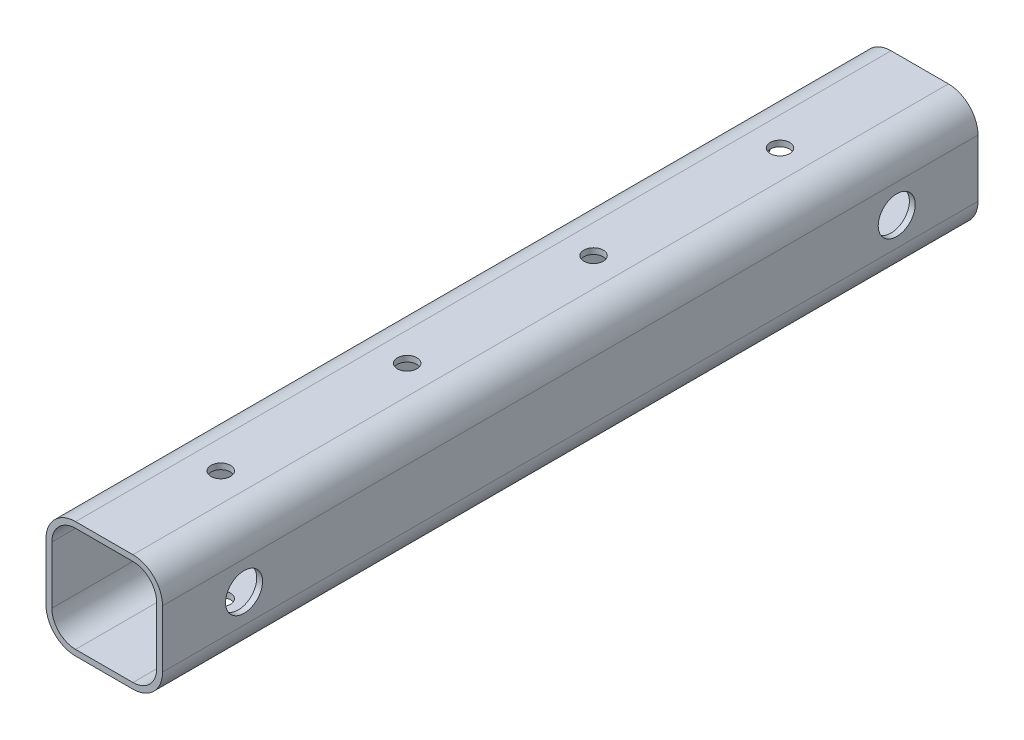
ISO-10303-21;
HEADER;
FILE_DESCRIPTION(('STEP AP214'),'2;1');
FILE_NAME('part.step','',(''),(''),'','','');
FILE_SCHEMA(('AUTOMOTIVE_DESIGN { 1 0 10303 214 1 1 1 1 }'));
ENDSEC;
DATA;
#1=APPLICATION_CONTEXT('core data for automotive mechanical design processes');
#2=APPLICATION_PROTOCOL_DEFINITION('international standard','automotive_design',2000,#1);
#3=PRODUCT_CONTEXT('',#1,'mechanical');
#4=PRODUCT('Part','Part','',(#3));
#5=PRODUCT_RELATED_PRODUCT_CATEGORY('part','',(#4));
#6=PRODUCT_DEFINITION_FORMATION('','',#4);
#7=PRODUCT_DEFINITION_CONTEXT('part definition',#1,'design');
#8=PRODUCT_DEFINITION('design','',#6,#7);
#9=PRODUCT_DEFINITION_SHAPE('','',#8);
#10=(LENGTH_UNIT() NAMED_UNIT(*) SI_UNIT(.MILLI.,.METRE.));
#11=(NAMED_UNIT(*) PLANE_ANGLE_UNIT() SI_UNIT($,.RADIAN.));
#12=(NAMED_UNIT(*) SI_UNIT($,.STERADIAN.) SOLID_ANGLE_UNIT());
#13=UNCERTAINTY_MEASURE_WITH_UNIT(LENGTH_MEASURE(1.E-05),#10,'distance_accuracy_value','');
#14=(GEOMETRIC_REPRESENTATION_CONTEXT(3) GLOBAL_UNCERTAINTY_ASSIGNED_CONTEXT((#13)) GLOBAL_UNIT_ASSIGNED_CONTEXT((#10,
#11,#12)) REPRESENTATION_CONTEXT('',''));
#15=CARTESIAN_POINT('',(0.,0.,0.));
#16=DIRECTION('',(0.,0.,1.));
#17=DIRECTION('',(1.,0.,0.));
#18=AXIS2_PLACEMENT_3D('',#15,#16,#17);
#19=CARTESIAN_POINT('',(12.3,12.3,-350.));
#20=DIRECTION('',(0.,0.,1.));
#21=DIRECTION('',(1.,0.,0.));
#22=AXIS2_PLACEMENT_3D('',#19,#20,#21);
#23=CYLINDRICAL_SURFACE('',#22,12.7);
#24=CARTESIAN_POINT('',(12.3,12.3,0.));
#25=DIRECTION('',(0.,0.,-1.));
#26=DIRECTION('',(-1.,0.,0.));
#27=AXIS2_PLACEMENT_3D('',#24,#25,#26);
#28=CIRCLE('',#27,12.7);
#29=CARTESIAN_POINT('',(12.3,25.,0.));
#30=VERTEX_POINT('',#29);
#31=CARTESIAN_POINT('',(25.,12.3,0.));
#32=VERTEX_POINT('',#31);
#33=EDGE_CURVE('E242',#30,#32,#28,.T.);
#34=ORIENTED_EDGE('',*,*,#33,.T.);
#35=DIRECTION('',(0.,0.,1.));
#36=VECTOR('',#35,1.);
#37=CARTESIAN_POINT('',(25.,12.3,-350.));
#38=LINE('',#37,#36);
#39=CARTESIAN_POINT('',(25.,12.3,-350.));
#40=VERTEX_POINT('',#39);
#41=EDGE_CURVE('E12',#40,#32,#38,.T.);
#42=ORIENTED_EDGE('',*,*,#41,.F.);
#43=CARTESIAN_POINT('',(12.3,12.3,-350.));
#44=DIRECTION('',(0.,0.,-1.));
#45=DIRECTION('',(-1.,0.,0.));
#46=AXIS2_PLACEMENT_3D('',#43,#44,#45);
#47=CIRCLE('',#46,12.7);
#48=CARTESIAN_POINT('',(12.3,25.,-350.));
#49=VERTEX_POINT('',#48);
#50=EDGE_CURVE('E321',#49,#40,#47,.T.);
#51=ORIENTED_EDGE('',*,*,#50,.F.);
#52=DIRECTION('',(0.,0.,1.));
#53=VECTOR('',#52,1.);
#54=CARTESIAN_POINT('',(12.3,25.,-350.));
#55=LINE('',#54,#53);
#56=EDGE_CURVE('E257',#49,#30,#55,.T.);
#57=ORIENTED_EDGE('',*,*,#56,.T.);
#58=EDGE_LOOP('',(#34,#42,#51,#57));
#59=FACE_BOUND('',#58,.T.);
#60=ADVANCED_FACE('F68',(#59),#23,.T.);
#61=CARTESIAN_POINT('',(25.,12.3,-350.));
#62=DIRECTION('',(-1.,0.,0.));
#63=DIRECTION('',(0.,0.,1.));
#64=AXIS2_PLACEMENT_3D('',#61,#62,#63);
#65=PLANE('',#64);
#66=CARTESIAN_POINT('',(25.,2.08166817117217E-13,-315.113369307392));
#67=DIRECTION('',(-1.,0.,0.));
#68=DIRECTION('',(0.,0.,1.));
#69=AXIS2_PLACEMENT_3D('',#66,#67,#68);
#70=CIRCLE('',#69,7.93749999999998);
#71=CARTESIAN_POINT('',(25.,2.08166817117217E-13,-307.175869307392));
#72=VERTEX_POINT('',#71);
#73=EDGE_CURVE('E516',#72,#72,#70,.F.);
#74=ORIENTED_EDGE('',*,*,#73,.F.);
#75=EDGE_LOOP('',(#74));
#76=FACE_BOUND('',#75,.T.);
#77=CARTESIAN_POINT('',(25.,-2.70616862252382E-13,-34.9999999999997));
#78=DIRECTION('',(-1.,0.,0.));
#79=DIRECTION('',(0.,0.,1.));
#80=AXIS2_PLACEMENT_3D('',#77,#78,#79);
#81=CIRCLE('',#80,7.93750000000001);
#82=CARTESIAN_POINT('',(25.,-2.70616862252382E-13,-27.0624999999997));
#83=VERTEX_POINT('',#82);
#84=EDGE_CURVE('E284',#83,#83,#81,.F.);
#85=ORIENTED_EDGE('',*,*,#84,.F.);
#86=EDGE_LOOP('',(#85));
#87=FACE_BOUND('',#86,.T.);
#88=DIRECTION('',(0.,-1.,0.));
#89=VECTOR('',#88,1.);
#90=CARTESIAN_POINT('',(25.,12.3,0.));
#91=LINE('',#90,#89);
#92=CARTESIAN_POINT('',(25.,-12.3,0.));
#93=VERTEX_POINT('',#92);
#94=EDGE_CURVE('E245',#32,#93,#91,.T.);
#95=ORIENTED_EDGE('',*,*,#94,.T.);
#96=DIRECTION('',(0.,0.,1.));
#97=VECTOR('',#96,1.);
#98=CARTESIAN_POINT('',(25.,-12.3,-350.));
#99=LINE('',#98,#97);
#100=CARTESIAN_POINT('',(25.,-12.3,-350.));
#101=VERTEX_POINT('',#100);
#102=EDGE_CURVE('E78',#101,#93,#99,.T.);
#103=ORIENTED_EDGE('',*,*,#102,.F.);
#104=DIRECTION('',(0.,-1.,0.));
#105=VECTOR('',#104,1.);
#106=CARTESIAN_POINT('',(25.,12.3,-350.));
#107=LINE('',#106,#105);
#108=EDGE_CURVE('E323',#40,#101,#107,.T.);
#109=ORIENTED_EDGE('',*,*,#108,.F.);
#110=ORIENTED_EDGE('',*,*,#41,.T.);
#111=EDGE_LOOP('',(#95,#103,#109,#110));
#112=FACE_BOUND('',#111,.T.);
#113=ADVANCED_FACE('F364',(#76,#87,#112),#65,.F.);
#114=CARTESIAN_POINT('',(12.3,-12.3,-350.));
#115=DIRECTION('',(0.,0.,1.));
#116=DIRECTION('',(1.,0.,0.));
#117=AXIS2_PLACEMENT_3D('',#114,#115,#116);
#118=CYLINDRICAL_SURFACE('',#117,12.7);
#119=CARTESIAN_POINT('',(12.3,-12.3,0.));
#120=DIRECTION('',(0.,0.,-1.));
#121=DIRECTION('',(-1.,0.,0.));
#122=AXIS2_PLACEMENT_3D('',#119,#120,#121);
#123=CIRCLE('',#122,12.7);
#124=CARTESIAN_POINT('',(12.3,-25.,0.));
#125=VERTEX_POINT('',#124);
#126=EDGE_CURVE('E247',#93,#125,#123,.T.);
#127=ORIENTED_EDGE('',*,*,#126,.T.);
#128=DIRECTION('',(0.,0.,1.));
#129=VECTOR('',#128,1.);
#130=CARTESIAN_POINT('',(12.3,-25.,-350.));
#131=LINE('',#130,#129);
#132=CARTESIAN_POINT('',(12.3,-25.,-350.));
#133=VERTEX_POINT('',#132);
#134=EDGE_CURVE('E264',#133,#125,#131,.T.);
#135=ORIENTED_EDGE('',*,*,#134,.F.);
#136=CARTESIAN_POINT('',(12.3,-12.3,-350.));
#137=DIRECTION('',(0.,0.,-1.));
#138=DIRECTION('',(-1.,0.,0.));
#139=AXIS2_PLACEMENT_3D('',#136,#137,#138);
#140=CIRCLE('',#139,12.7);
#141=EDGE_CURVE('E325',#101,#133,#140,.T.);
#142=ORIENTED_EDGE('',*,*,#141,.F.);
#143=ORIENTED_EDGE('',*,*,#102,.T.);
#144=EDGE_LOOP('',(#127,#135,#142,#143));
#145=FACE_BOUND('',#144,.T.);
#146=ADVANCED_FACE('F369',(#145),#118,.T.);
#147=CARTESIAN_POINT('',(-12.3,-25.,-350.));
#148=DIRECTION('',(0.,1.,0.));
#149=DIRECTION('',(0.,0.,1.));
#150=AXIS2_PLACEMENT_3D('',#147,#148,#149);
#151=PLANE('',#150);
#152=CARTESIAN_POINT('',(2.22044604925031E-12,-25.,-289.99999999999));
#153=DIRECTION('',(0.,1.,0.));
#154=DIRECTION('',(0.,0.,1.));
#155=AXIS2_PLACEMENT_3D('',#152,#153,#154);
#156=CIRCLE('',#155,4.1671875);
#157=CARTESIAN_POINT('',(2.22044604925031E-12,-25.,-285.83281249999));
#158=VERTEX_POINT('',#157);
#159=EDGE_CURVE('E469',#158,#158,#156,.F.);
#160=ORIENTED_EDGE('',*,*,#159,.F.);
#161=EDGE_LOOP('',(#160));
#162=FACE_BOUND('',#161,.T.);
#163=CARTESIAN_POINT('',(1.77635683940025E-12,-25.,-209.99999999999));
#164=DIRECTION('',(0.,1.,0.));
#165=DIRECTION('',(0.,0.,1.));
#166=AXIS2_PLACEMENT_3D('',#163,#164,#165);
#167=CIRCLE('',#166,4.1671875);
#168=CARTESIAN_POINT('',(1.77635683940025E-12,-25.,-205.83281249999));
#169=VERTEX_POINT('',#168);
#170=EDGE_CURVE('E470',#169,#169,#167,.F.);
#171=ORIENTED_EDGE('',*,*,#170,.F.);
#172=EDGE_LOOP('',(#171));
#173=FACE_BOUND('',#172,.T.);
#174=CARTESIAN_POINT('',(1.33226762955019E-12,-25.,-129.99999999999));
#175=DIRECTION('',(0.,1.,0.));
#176=DIRECTION('',(0.,0.,1.));
#177=AXIS2_PLACEMENT_3D('',#174,#175,#176);
#178=CIRCLE('',#177,4.1671875);
#179=CARTESIAN_POINT('',(1.33226762955019E-12,-25.,-125.83281249999));
#180=VERTEX_POINT('',#179);
#181=EDGE_CURVE('E480',#180,#180,#178,.F.);
#182=ORIENTED_EDGE('',*,*,#181,.F.);
#183=EDGE_LOOP('',(#182));
#184=FACE_BOUND('',#183,.T.);
#185=CARTESIAN_POINT('',(8.88178419700125E-13,-25.,-49.9999999999902));
#186=DIRECTION('',(0.,1.,0.));
#187=DIRECTION('',(0.,0.,1.));
#188=AXIS2_PLACEMENT_3D('',#185,#186,#187);
#189=CIRCLE('',#188,4.1671875);
#190=CARTESIAN_POINT('',(8.88178419700125E-13,-25.,-45.8328124999902));
#191=VERTEX_POINT('',#190);
#192=EDGE_CURVE('E485',#191,#191,#189,.F.);
#193=ORIENTED_EDGE('',*,*,#192,.F.);
#194=EDGE_LOOP('',(#193));
#195=FACE_BOUND('',#194,.T.);
#196=DIRECTION('',(-1.,0.,0.));
#197=VECTOR('',#196,1.);
#198=CARTESIAN_POINT('',(-12.3,-25.,0.));
#199=LINE('',#198,#197);
#200=CARTESIAN_POINT('',(-12.3,-25.,0.));
#201=VERTEX_POINT('',#200);
#202=EDGE_CURVE('E249',#125,#201,#199,.T.);
#203=ORIENTED_EDGE('',*,*,#202,.T.);
#204=DIRECTION('',(0.,0.,1.));
#205=VECTOR('',#204,1.);
#206=CARTESIAN_POINT('',(-12.3,-25.,-350.));
#207=LINE('',#206,#205);
#208=CARTESIAN_POINT('',(-12.3,-25.,-350.));
#209=VERTEX_POINT('',#208);
#210=EDGE_CURVE('E261',#209,#201,#207,.T.);
#211=ORIENTED_EDGE('',*,*,#210,.F.);
#212=DIRECTION('',(-1.,0.,0.));
#213=VECTOR('',#212,1.);
#214=CARTESIAN_POINT('',(-12.3,-25.,-350.));
#215=LINE('',#214,#213);
#216=EDGE_CURVE('E327',#133,#209,#215,.T.);
#217=ORIENTED_EDGE('',*,*,#216,.F.);
#218=ORIENTED_EDGE('',*,*,#134,.T.);
#219=EDGE_LOOP('',(#203,#211,#217,#218));
#220=FACE_BOUND('',#219,.T.);
#221=ADVANCED_FACE('F333',(#162,#173,#184,#195,#220),#151,.F.);
#222=CARTESIAN_POINT('',(-12.3,-12.3,-350.));
#223=DIRECTION('',(0.,0.,1.));
#224=DIRECTION('',(1.,0.,0.));
#225=AXIS2_PLACEMENT_3D('',#222,#223,#224);
#226=CYLINDRICAL_SURFACE('',#225,12.7);
#227=CARTESIAN_POINT('',(-12.3,-12.3,0.));
#228=DIRECTION('',(0.,0.,-1.));
#229=DIRECTION('',(-1.,0.,0.));
#230=AXIS2_PLACEMENT_3D('',#227,#228,#229);
#231=CIRCLE('',#230,12.7);
#232=CARTESIAN_POINT('',(-25.,-12.3,0.));
#233=VERTEX_POINT('',#232);
#234=EDGE_CURVE('E251',#201,#233,#231,.T.);
#235=ORIENTED_EDGE('',*,*,#234,.T.);
#236=DIRECTION('',(0.,0.,1.));
#237=VECTOR('',#236,1.);
#238=CARTESIAN_POINT('',(-25.,-12.3,-350.));
#239=LINE('',#238,#237);
#240=CARTESIAN_POINT('',(-25.,-12.3,-350.));
#241=VERTEX_POINT('',#240);
#242=EDGE_CURVE('E208',#241,#233,#239,.T.);
#243=ORIENTED_EDGE('',*,*,#242,.F.);
#244=CARTESIAN_POINT('',(-12.3,-12.3,-350.));
#245=DIRECTION('',(0.,0.,-1.));
#246=DIRECTION('',(-1.,0.,0.));
#247=AXIS2_PLACEMENT_3D('',#244,#245,#246);
#248=CIRCLE('',#247,12.7);
#249=EDGE_CURVE('E199',#209,#241,#248,.T.);
#250=ORIENTED_EDGE('',*,*,#249,.F.);
#251=ORIENTED_EDGE('',*,*,#210,.T.);
#252=EDGE_LOOP('',(#235,#243,#250,#251));
#253=FACE_BOUND('',#252,.T.);
#254=ADVANCED_FACE('F337',(#253),#226,.T.);
#255=CARTESIAN_POINT('',(-25.,-12.3,-350.));
#256=DIRECTION('',(1.,0.,0.));
#257=DIRECTION('',(0.,0.,-1.));
#258=AXIS2_PLACEMENT_3D('',#255,#256,#257);
#259=PLANE('',#258);
#260=CARTESIAN_POINT('',(-25.,2.08166817117217E-13,-315.113369307392));
#261=DIRECTION('',(-1.,0.,0.));
#262=DIRECTION('',(0.,0.,1.));
#263=AXIS2_PLACEMENT_3D('',#260,#261,#262);
#264=CIRCLE('',#263,7.93749999999998);
#265=CARTESIAN_POINT('',(-25.,2.08166817117217E-13,-307.175869307392));
#266=VERTEX_POINT('',#265);
#267=EDGE_CURVE('E513',#266,#266,#264,.T.);
#268=ORIENTED_EDGE('',*,*,#267,.F.);
#269=EDGE_LOOP('',(#268));
#270=FACE_BOUND('',#269,.T.);
#271=CARTESIAN_POINT('',(-25.,-2.70616862252382E-13,-34.9999999999997));
#272=DIRECTION('',(-1.,0.,0.));
#273=DIRECTION('',(0.,0.,1.));
#274=AXIS2_PLACEMENT_3D('',#271,#272,#273);
#275=CIRCLE('',#274,7.93750000000001);
#276=CARTESIAN_POINT('',(-25.,-2.70616862252382E-13,-27.0624999999997));
#277=VERTEX_POINT('',#276);
#278=EDGE_CURVE('E290',#277,#277,#275,.T.);
#279=ORIENTED_EDGE('',*,*,#278,.F.);
#280=EDGE_LOOP('',(#279));
#281=FACE_BOUND('',#280,.T.);
#282=DIRECTION('',(0.,1.,0.));
#283=VECTOR('',#282,1.);
#284=CARTESIAN_POINT('',(-25.,-12.3,0.));
#285=LINE('',#284,#283);
#286=CARTESIAN_POINT('',(-25.,12.3,0.));
#287=VERTEX_POINT('',#286);
#288=EDGE_CURVE('E207',#233,#287,#285,.T.);
#289=ORIENTED_EDGE('',*,*,#288,.T.);
#290=DIRECTION('',(0.,0.,1.));
#291=VECTOR('',#290,1.);
#292=CARTESIAN_POINT('',(-25.,12.3,-350.));
#293=LINE('',#292,#291);
#294=CARTESIAN_POINT('',(-25.,12.3,-350.));
#295=VERTEX_POINT('',#294);
#296=EDGE_CURVE('E204',#295,#287,#293,.T.);
#297=ORIENTED_EDGE('',*,*,#296,.F.);
#298=DIRECTION('',(0.,1.,0.));
#299=VECTOR('',#298,1.);
#300=CARTESIAN_POINT('',(-25.,-12.3,-350.));
#301=LINE('',#300,#299);
#302=EDGE_CURVE('E193',#241,#295,#301,.T.);
#303=ORIENTED_EDGE('',*,*,#302,.F.);
#304=ORIENTED_EDGE('',*,*,#242,.T.);
#305=EDGE_LOOP('',(#289,#297,#303,#304));
#306=FACE_BOUND('',#305,.T.);
#307=ADVANCED_FACE('F205',(#270,#281,#306),#259,.F.);
#308=CARTESIAN_POINT('',(-12.3,12.3,-350.));
#309=DIRECTION('',(0.,0.,1.));
#310=DIRECTION('',(1.,0.,0.));
#311=AXIS2_PLACEMENT_3D('',#308,#309,#310);
#312=CYLINDRICAL_SURFACE('',#311,12.7);
#313=CARTESIAN_POINT('',(-12.3,12.3,0.));
#314=DIRECTION('',(0.,0.,-1.));
#315=DIRECTION('',(-1.,0.,0.));
#316=AXIS2_PLACEMENT_3D('',#313,#314,#315);
#317=CIRCLE('',#316,12.7);
#318=CARTESIAN_POINT('',(-12.3,25.,0.));
#319=VERTEX_POINT('',#318);
#320=EDGE_CURVE('E140',#287,#319,#317,.T.);
#321=ORIENTED_EDGE('',*,*,#320,.T.);
#322=DIRECTION('',(0.,0.,1.));
#323=VECTOR('',#322,1.);
#324=CARTESIAN_POINT('',(-12.3,25.,-350.));
#325=LINE('',#324,#323);
#326=CARTESIAN_POINT('',(-12.3,25.,-350.));
#327=VERTEX_POINT('',#326);
#328=EDGE_CURVE('E209',#327,#319,#325,.T.);
#329=ORIENTED_EDGE('',*,*,#328,.F.);
#330=CARTESIAN_POINT('',(-12.3,12.3,-350.));
#331=DIRECTION('',(0.,0.,-1.));
#332=DIRECTION('',(-1.,0.,0.));
#333=AXIS2_PLACEMENT_3D('',#330,#331,#332);
#334=CIRCLE('',#333,12.7);
#335=EDGE_CURVE('E197',#295,#327,#334,.T.);
#336=ORIENTED_EDGE('',*,*,#335,.F.);
#337=ORIENTED_EDGE('',*,*,#296,.T.);
#338=EDGE_LOOP('',(#321,#329,#336,#337));
#339=FACE_BOUND('',#338,.T.);
#340=ADVANCED_FACE('F211',(#339),#312,.T.);
#341=CARTESIAN_POINT('',(12.3,-12.3,-350.));
#342=DIRECTION('',(0.,0.,1.));
#343=DIRECTION('',(1.,0.,0.));
#344=AXIS2_PLACEMENT_3D('',#341,#342,#343);
#345=CYLINDRICAL_SURFACE('',#344,10.2);
#346=CARTESIAN_POINT('',(12.3,-12.3,0.));
#347=DIRECTION('',(0.,0.,-1.));
#348=DIRECTION('',(-1.,0.,0.));
#349=AXIS2_PLACEMENT_3D('',#346,#347,#348);
#350=CIRCLE('',#349,10.2);
#351=CARTESIAN_POINT('',(22.5,-12.3,0.));
#352=VERTEX_POINT('',#351);
#353=CARTESIAN_POINT('',(12.3,-22.5,0.));
#354=VERTEX_POINT('',#353);
#355=EDGE_CURVE('E217',#352,#354,#350,.T.);
#356=ORIENTED_EDGE('',*,*,#355,.F.);
#357=DIRECTION('',(0.,0.,1.));
#358=VECTOR('',#357,1.);
#359=CARTESIAN_POINT('',(22.5,-12.3,-350.));
#360=LINE('',#359,#358);
#361=CARTESIAN_POINT('',(22.5,-12.3,-350.));
#362=VERTEX_POINT('',#361);
#363=EDGE_CURVE('E154',#362,#352,#360,.T.);
#364=ORIENTED_EDGE('',*,*,#363,.F.);
#365=CARTESIAN_POINT('',(12.3,-12.3,-350.));
#366=DIRECTION('',(0.,0.,-1.));
#367=DIRECTION('',(-1.,0.,0.));
#368=AXIS2_PLACEMENT_3D('',#365,#366,#367);
#369=CIRCLE('',#368,10.2);
#370=CARTESIAN_POINT('',(12.3,-22.5,-350.));
#371=VERTEX_POINT('',#370);
#372=EDGE_CURVE('E256',#362,#371,#369,.T.);
#373=ORIENTED_EDGE('',*,*,#372,.T.);
#374=DIRECTION('',(0.,0.,1.));
#375=VECTOR('',#374,1.);
#376=CARTESIAN_POINT('',(12.3,-22.5,-350.));
#377=LINE('',#376,#375);
#378=EDGE_CURVE('E213',#371,#354,#377,.T.);
#379=ORIENTED_EDGE('',*,*,#378,.T.);
#380=EDGE_LOOP('',(#356,#364,#373,#379));
#381=FACE_BOUND('',#380,.T.);
#382=ADVANCED_FACE('F70',(#381),#345,.F.);
#383=CARTESIAN_POINT('',(22.5,12.3,-350.));
#384=DIRECTION('',(-1.,0.,0.));
#385=DIRECTION('',(0.,0.,1.));
#386=AXIS2_PLACEMENT_3D('',#383,#384,#385);
#387=PLANE('',#386);
#388=CARTESIAN_POINT('',(22.5,2.08166817117217E-13,-315.113369307392));
#389=DIRECTION('',(-1.,0.,0.));
#390=DIRECTION('',(0.,0.,1.));
#391=AXIS2_PLACEMENT_3D('',#388,#389,#390);
#392=CIRCLE('',#391,7.93749999999998);
#393=CARTESIAN_POINT('',(22.5,2.08166817117217E-13,-307.175869307392));
#394=VERTEX_POINT('',#393);
#395=EDGE_CURVE('E295',#394,#394,#392,.T.);
#396=ORIENTED_EDGE('',*,*,#395,.F.);
#397=EDGE_LOOP('',(#396));
#398=FACE_BOUND('',#397,.T.);
#399=CARTESIAN_POINT('',(22.5,-2.70616862252382E-13,-34.9999999999997));
#400=DIRECTION('',(-1.,0.,0.));
#401=DIRECTION('',(0.,0.,1.));
#402=AXIS2_PLACEMENT_3D('',#399,#400,#401);
#403=CIRCLE('',#402,7.93750000000001);
#404=CARTESIAN_POINT('',(22.5,-2.70616862252382E-13,-27.0624999999997));
#405=VERTEX_POINT('',#404);
#406=EDGE_CURVE('E221',#405,#405,#403,.T.);
#407=ORIENTED_EDGE('',*,*,#406,.F.);
#408=EDGE_LOOP('',(#407));
#409=FACE_BOUND('',#408,.T.);
#410=DIRECTION('',(0.,-1.,0.));
#411=VECTOR('',#410,1.);
#412=CARTESIAN_POINT('',(22.5,12.3,0.));
#413=LINE('',#412,#411);
#414=CARTESIAN_POINT('',(22.5,12.3,0.));
#415=VERTEX_POINT('',#414);
#416=EDGE_CURVE('E220',#415,#352,#413,.T.);
#417=ORIENTED_EDGE('',*,*,#416,.F.);
#418=DIRECTION('',(0.,0.,1.));
#419=VECTOR('',#418,1.);
#420=CARTESIAN_POINT('',(22.5,12.3,-350.));
#421=LINE('',#420,#419);
#422=CARTESIAN_POINT('',(22.5,12.3,-350.));
#423=VERTEX_POINT('',#422);
#424=EDGE_CURVE('E280',#423,#415,#421,.T.);
#425=ORIENTED_EDGE('',*,*,#424,.F.);
#426=DIRECTION('',(0.,-1.,0.));
#427=VECTOR('',#426,1.);
#428=CARTESIAN_POINT('',(22.5,12.3,-350.));
#429=LINE('',#428,#427);
#430=EDGE_CURVE('E300',#423,#362,#429,.T.);
#431=ORIENTED_EDGE('',*,*,#430,.T.);
#432=ORIENTED_EDGE('',*,*,#363,.T.);
#433=EDGE_LOOP('',(#417,#425,#431,#432));
#434=FACE_BOUND('',#433,.T.);
#435=ADVANCED_FACE('F391',(#398,#409,#434),#387,.T.);
#436=CARTESIAN_POINT('',(12.3,12.3,-350.));
#437=DIRECTION('',(0.,0.,1.));
#438=DIRECTION('',(1.,0.,0.));
#439=AXIS2_PLACEMENT_3D('',#436,#437,#438);
#440=CYLINDRICAL_SURFACE('',#439,10.2);
#441=CARTESIAN_POINT('',(12.3,12.3,0.));
#442=DIRECTION('',(0.,0.,-1.));
#443=DIRECTION('',(-1.,0.,0.));
#444=AXIS2_PLACEMENT_3D('',#441,#442,#443);
#445=CIRCLE('',#444,10.2);
#446=CARTESIAN_POINT('',(12.3,22.5,0.));
#447=VERTEX_POINT('',#446);
#448=EDGE_CURVE('E224',#447,#415,#445,.T.);
#449=ORIENTED_EDGE('',*,*,#448,.F.);
#450=DIRECTION('',(0.,0.,1.));
#451=VECTOR('',#450,1.);
#452=CARTESIAN_POINT('',(12.3,22.5,-350.));
#453=LINE('',#452,#451);
#454=CARTESIAN_POINT('',(12.3,22.5,-350.));
#455=VERTEX_POINT('',#454);
#456=EDGE_CURVE('E278',#455,#447,#453,.T.);
#457=ORIENTED_EDGE('',*,*,#456,.F.);
#458=CARTESIAN_POINT('',(12.3,12.3,-350.));
#459=DIRECTION('',(0.,0.,-1.));
#460=DIRECTION('',(-1.,0.,0.));
#461=AXIS2_PLACEMENT_3D('',#458,#459,#460);
#462=CIRCLE('',#461,10.2);
#463=EDGE_CURVE('E303',#455,#423,#462,.T.);
#464=ORIENTED_EDGE('',*,*,#463,.T.);
#465=ORIENTED_EDGE('',*,*,#424,.T.);
#466=EDGE_LOOP('',(#449,#457,#464,#465));
#467=FACE_BOUND('',#466,.T.);
#468=ADVANCED_FACE('F388',(#467),#440,.F.);
#469=CARTESIAN_POINT('',(12.3,22.5,-350.));
#470=DIRECTION('',(0.,-1.,0.));
#471=DIRECTION('',(0.,0.,-1.));
#472=AXIS2_PLACEMENT_3D('',#469,#470,#471);
#473=PLANE('',#472);
#474=CARTESIAN_POINT('',(2.22044604925031E-12,22.5,-289.99999999999));
#475=DIRECTION('',(0.,-1.,0.));
#476=DIRECTION('',(0.,0.,-1.));
#477=AXIS2_PLACEMENT_3D('',#474,#475,#476);
#478=CIRCLE('',#477,4.1671875);
#479=CARTESIAN_POINT('',(2.22044604925031E-12,22.5,-294.16718749999));
#480=VERTEX_POINT('',#479);
#481=EDGE_CURVE('E466',#480,#480,#478,.T.);
#482=ORIENTED_EDGE('',*,*,#481,.F.);
#483=EDGE_LOOP('',(#482));
#484=FACE_BOUND('',#483,.T.);
#485=CARTESIAN_POINT('',(1.77635683940025E-12,22.5,-209.99999999999));
#486=DIRECTION('',(0.,-1.,0.));
#487=DIRECTION('',(0.,0.,-1.));
#488=AXIS2_PLACEMENT_3D('',#485,#486,#487);
#489=CIRCLE('',#488,4.1671875);
#490=CARTESIAN_POINT('',(1.77635683940025E-12,22.5,-214.16718749999));
#491=VERTEX_POINT('',#490);
#492=EDGE_CURVE('E507',#491,#491,#489,.T.);
#493=ORIENTED_EDGE('',*,*,#492,.F.);
#494=EDGE_LOOP('',(#493));
#495=FACE_BOUND('',#494,.T.);
#496=CARTESIAN_POINT('',(1.33226762955019E-12,22.5,-129.99999999999));
#497=DIRECTION('',(0.,-1.,0.));
#498=DIRECTION('',(0.,0.,-1.));
#499=AXIS2_PLACEMENT_3D('',#496,#497,#498);
#500=CIRCLE('',#499,4.1671875);
#501=CARTESIAN_POINT('',(1.33226762955019E-12,22.5,-134.16718749999));
#502=VERTEX_POINT('',#501);
#503=EDGE_CURVE('E501',#502,#502,#500,.T.);
#504=ORIENTED_EDGE('',*,*,#503,.F.);
#505=EDGE_LOOP('',(#504));
#506=FACE_BOUND('',#505,.T.);
#507=CARTESIAN_POINT('',(8.88178419700125E-13,22.5,-49.9999999999902));
#508=DIRECTION('',(0.,-1.,0.));
#509=DIRECTION('',(0.,0.,-1.));
#510=AXIS2_PLACEMENT_3D('',#507,#508,#509);
#511=CIRCLE('',#510,4.1671875);
#512=CARTESIAN_POINT('',(8.88178419700125E-13,22.5,-54.1671874999902));
#513=VERTEX_POINT('',#512);
#514=EDGE_CURVE('E495',#513,#513,#511,.T.);
#515=ORIENTED_EDGE('',*,*,#514,.F.);
#516=EDGE_LOOP('',(#515));
#517=FACE_BOUND('',#516,.T.);
#518=DIRECTION('',(1.,0.,0.));
#519=VECTOR('',#518,1.);
#520=CARTESIAN_POINT('',(12.3,22.5,0.));
#521=LINE('',#520,#519);
#522=CARTESIAN_POINT('',(-12.3,22.5,0.));
#523=VERTEX_POINT('',#522);
#524=EDGE_CURVE('E227',#523,#447,#521,.T.);
#525=ORIENTED_EDGE('',*,*,#524,.F.);
#526=DIRECTION('',(0.,0.,1.));
#527=VECTOR('',#526,1.);
#528=CARTESIAN_POINT('',(-12.3,22.5,-350.));
#529=LINE('',#528,#527);
#530=CARTESIAN_POINT('',(-12.3,22.5,-350.));
#531=VERTEX_POINT('',#530);
#532=EDGE_CURVE('E276',#531,#523,#529,.T.);
#533=ORIENTED_EDGE('',*,*,#532,.F.);
#534=DIRECTION('',(1.,0.,0.));
#535=VECTOR('',#534,1.);
#536=CARTESIAN_POINT('',(12.3,22.5,-350.));
#537=LINE('',#536,#535);
#538=EDGE_CURVE('E306',#531,#455,#537,.T.);
#539=ORIENTED_EDGE('',*,*,#538,.T.);
#540=ORIENTED_EDGE('',*,*,#456,.T.);
#541=EDGE_LOOP('',(#525,#533,#539,#540));
#542=FACE_BOUND('',#541,.T.);
#543=ADVANCED_FACE('F384',(#484,#495,#506,#517,#542),#473,.T.);
#544=CARTESIAN_POINT('',(-12.3,12.3,-350.));
#545=DIRECTION('',(0.,0.,1.));
#546=DIRECTION('',(1.,0.,0.));
#547=AXIS2_PLACEMENT_3D('',#544,#545,#546);
#548=CYLINDRICAL_SURFACE('',#547,10.2);
#549=CARTESIAN_POINT('',(-12.3,12.3,0.));
#550=DIRECTION('',(0.,0.,-1.));
#551=DIRECTION('',(-1.,0.,0.));
#552=AXIS2_PLACEMENT_3D('',#549,#550,#551);
#553=CIRCLE('',#552,10.2);
#554=CARTESIAN_POINT('',(-22.5,12.3,0.));
#555=VERTEX_POINT('',#554);
#556=EDGE_CURVE('E230',#555,#523,#553,.T.);
#557=ORIENTED_EDGE('',*,*,#556,.F.);
#558=DIRECTION('',(0.,0.,1.));
#559=VECTOR('',#558,1.);
#560=CARTESIAN_POINT('',(-22.5,12.3,-350.));
#561=LINE('',#560,#559);
#562=CARTESIAN_POINT('',(-22.5,12.3,-350.));
#563=VERTEX_POINT('',#562);
#564=EDGE_CURVE('E274',#563,#555,#561,.T.);
#565=ORIENTED_EDGE('',*,*,#564,.F.);
#566=CARTESIAN_POINT('',(-12.3,12.3,-350.));
#567=DIRECTION('',(0.,0.,-1.));
#568=DIRECTION('',(-1.,0.,0.));
#569=AXIS2_PLACEMENT_3D('',#566,#567,#568);
#570=CIRCLE('',#569,10.2);
#571=EDGE_CURVE('E309',#563,#531,#570,.T.);
#572=ORIENTED_EDGE('',*,*,#571,.T.);
#573=ORIENTED_EDGE('',*,*,#532,.T.);
#574=EDGE_LOOP('',(#557,#565,#572,#573));
#575=FACE_BOUND('',#574,.T.);
#576=ADVANCED_FACE('F380',(#575),#548,.F.);
#577=CARTESIAN_POINT('',(-22.5,-12.3,-350.));
#578=DIRECTION('',(1.,0.,0.));
#579=DIRECTION('',(0.,0.,-1.));
#580=AXIS2_PLACEMENT_3D('',#577,#578,#579);
#581=PLANE('',#580);
#582=CARTESIAN_POINT('',(-22.5,2.08166817117217E-13,-315.113369307392));
#583=DIRECTION('',(1.,0.,0.));
#584=DIRECTION('',(0.,0.,-1.));
#585=AXIS2_PLACEMENT_3D('',#582,#583,#584);
#586=CIRCLE('',#585,7.93749999999998);
#587=CARTESIAN_POINT('',(-22.5,2.08166817117217E-13,-323.050869307392));
#588=VERTEX_POINT('',#587);
#589=EDGE_CURVE('E72',#588,#588,#586,.T.);
#590=ORIENTED_EDGE('',*,*,#589,.F.);
#591=EDGE_LOOP('',(#590));
#592=FACE_BOUND('',#591,.T.);
#593=CARTESIAN_POINT('',(-22.5,-2.70616862252382E-13,-34.9999999999997));
#594=DIRECTION('',(1.,0.,0.));
#595=DIRECTION('',(0.,0.,-1.));
#596=AXIS2_PLACEMENT_3D('',#593,#594,#595);
#597=CIRCLE('',#596,7.93750000000001);
#598=CARTESIAN_POINT('',(-22.5,-2.70616862252382E-13,-42.9374999999997));
#599=VERTEX_POINT('',#598);
#600=EDGE_CURVE('E282',#599,#599,#597,.T.);
#601=ORIENTED_EDGE('',*,*,#600,.F.);
#602=EDGE_LOOP('',(#601));
#603=FACE_BOUND('',#602,.T.);
#604=DIRECTION('',(0.,1.,0.));
#605=VECTOR('',#604,1.);
#606=CARTESIAN_POINT('',(-22.5,-12.3,0.));
#607=LINE('',#606,#605);
#608=CARTESIAN_POINT('',(-22.5,-12.3,0.));
#609=VERTEX_POINT('',#608);
#610=EDGE_CURVE('E233',#609,#555,#607,.T.);
#611=ORIENTED_EDGE('',*,*,#610,.F.);
#612=DIRECTION('',(0.,0.,1.));
#613=VECTOR('',#612,1.);
#614=CARTESIAN_POINT('',(-22.5,-12.3,-350.));
#615=LINE('',#614,#613);
#616=CARTESIAN_POINT('',(-22.5,-12.3,-350.));
#617=VERTEX_POINT('',#616);
#618=EDGE_CURVE('E272',#617,#609,#615,.T.);
#619=ORIENTED_EDGE('',*,*,#618,.F.);
#620=DIRECTION('',(0.,1.,0.));
#621=VECTOR('',#620,1.);
#622=CARTESIAN_POINT('',(-22.5,-12.3,-350.));
#623=LINE('',#622,#621);
#624=EDGE_CURVE('E312',#617,#563,#623,.T.);
#625=ORIENTED_EDGE('',*,*,#624,.T.);
#626=ORIENTED_EDGE('',*,*,#564,.T.);
#627=EDGE_LOOP('',(#611,#619,#625,#626));
#628=FACE_BOUND('',#627,.T.);
#629=ADVANCED_FACE('F376',(#592,#603,#628),#581,.T.);
#630=CARTESIAN_POINT('',(-12.3,-12.3,-350.));
#631=DIRECTION('',(0.,0.,1.));
#632=DIRECTION('',(1.,0.,0.));
#633=AXIS2_PLACEMENT_3D('',#630,#631,#632);
#634=CYLINDRICAL_SURFACE('',#633,10.2);
#635=CARTESIAN_POINT('',(-12.3,-12.3,0.));
#636=DIRECTION('',(0.,0.,-1.));
#637=DIRECTION('',(-1.,0.,0.));
#638=AXIS2_PLACEMENT_3D('',#635,#636,#637);
#639=CIRCLE('',#638,10.2);
#640=CARTESIAN_POINT('',(-12.3,-22.5,0.));
#641=VERTEX_POINT('',#640);
#642=EDGE_CURVE('E236',#641,#609,#639,.T.);
#643=ORIENTED_EDGE('',*,*,#642,.F.);
#644=DIRECTION('',(0.,0.,1.));
#645=VECTOR('',#644,1.);
#646=CARTESIAN_POINT('',(-12.3,-22.5,-350.));
#647=LINE('',#646,#645);
#648=CARTESIAN_POINT('',(-12.3,-22.5,-350.));
#649=VERTEX_POINT('',#648);
#650=EDGE_CURVE('E270',#649,#641,#647,.T.);
#651=ORIENTED_EDGE('',*,*,#650,.F.);
#652=CARTESIAN_POINT('',(-12.3,-12.3,-350.));
#653=DIRECTION('',(0.,0.,-1.));
#654=DIRECTION('',(-1.,0.,0.));
#655=AXIS2_PLACEMENT_3D('',#652,#653,#654);
#656=CIRCLE('',#655,10.2);
#657=EDGE_CURVE('E315',#649,#617,#656,.T.);
#658=ORIENTED_EDGE('',*,*,#657,.T.);
#659=ORIENTED_EDGE('',*,*,#618,.T.);
#660=EDGE_LOOP('',(#643,#651,#658,#659));
#661=FACE_BOUND('',#660,.T.);
#662=ADVANCED_FACE('F356',(#661),#634,.F.);
#663=CARTESIAN_POINT('',(-12.3,-22.5,-350.));
#664=DIRECTION('',(0.,1.,0.));
#665=DIRECTION('',(0.,0.,1.));
#666=AXIS2_PLACEMENT_3D('',#663,#664,#665);
#667=PLANE('',#666);
#668=CARTESIAN_POINT('',(2.22044604925031E-12,-22.5,-289.99999999999));
#669=DIRECTION('',(0.,1.,0.));
#670=DIRECTION('',(0.,0.,1.));
#671=AXIS2_PLACEMENT_3D('',#668,#669,#670);
#672=CIRCLE('',#671,4.1671875);
#673=CARTESIAN_POINT('',(2.22044604925031E-12,-22.5,-285.83281249999));
#674=VERTEX_POINT('',#673);
#675=EDGE_CURVE('E510',#674,#674,#672,.T.);
#676=ORIENTED_EDGE('',*,*,#675,.F.);
#677=EDGE_LOOP('',(#676));
#678=FACE_BOUND('',#677,.T.);
#679=CARTESIAN_POINT('',(1.77635683940025E-12,-22.5,-209.99999999999));
#680=DIRECTION('',(0.,1.,0.));
#681=DIRECTION('',(0.,0.,1.));
#682=AXIS2_PLACEMENT_3D('',#679,#680,#681);
#683=CIRCLE('',#682,4.1671875);
#684=CARTESIAN_POINT('',(1.77635683940025E-12,-22.5,-205.83281249999));
#685=VERTEX_POINT('',#684);
#686=EDGE_CURVE('E504',#685,#685,#683,.T.);
#687=ORIENTED_EDGE('',*,*,#686,.F.);
#688=EDGE_LOOP('',(#687));
#689=FACE_BOUND('',#688,.T.);
#690=CARTESIAN_POINT('',(1.33226762955019E-12,-22.5,-129.99999999999));
#691=DIRECTION('',(0.,1.,0.));
#692=DIRECTION('',(0.,0.,1.));
#693=AXIS2_PLACEMENT_3D('',#690,#691,#692);
#694=CIRCLE('',#693,4.1671875);
#695=CARTESIAN_POINT('',(1.33226762955019E-12,-22.5,-125.83281249999));
#696=VERTEX_POINT('',#695);
#697=EDGE_CURVE('E498',#696,#696,#694,.T.);
#698=ORIENTED_EDGE('',*,*,#697,.F.);
#699=EDGE_LOOP('',(#698));
#700=FACE_BOUND('',#699,.T.);
#701=CARTESIAN_POINT('',(8.88178419700125E-13,-22.5,-49.9999999999902));
#702=DIRECTION('',(0.,1.,0.));
#703=DIRECTION('',(0.,0.,1.));
#704=AXIS2_PLACEMENT_3D('',#701,#702,#703);
#705=CIRCLE('',#704,4.1671875);
#706=CARTESIAN_POINT('',(8.88178419700125E-13,-22.5,-45.8328124999902));
#707=VERTEX_POINT('',#706);
#708=EDGE_CURVE('E473',#707,#707,#705,.T.);
#709=ORIENTED_EDGE('',*,*,#708,.F.);
#710=EDGE_LOOP('',(#709));
#711=FACE_BOUND('',#710,.T.);
#712=DIRECTION('',(-1.,0.,0.));
#713=VECTOR('',#712,1.);
#714=CARTESIAN_POINT('',(-12.3,-22.5,0.));
#715=LINE('',#714,#713);
#716=EDGE_CURVE('E239',#354,#641,#715,.T.);
#717=ORIENTED_EDGE('',*,*,#716,.F.);
#718=ORIENTED_EDGE('',*,*,#378,.F.);
#719=DIRECTION('',(-1.,0.,0.));
#720=VECTOR('',#719,1.);
#721=CARTESIAN_POINT('',(-12.3,-22.5,-350.));
#722=LINE('',#721,#720);
#723=EDGE_CURVE('E318',#371,#649,#722,.T.);
#724=ORIENTED_EDGE('',*,*,#723,.T.);
#725=ORIENTED_EDGE('',*,*,#650,.T.);
#726=EDGE_LOOP('',(#717,#718,#724,#725));
#727=FACE_BOUND('',#726,.T.);
#728=ADVANCED_FACE('F347',(#678,#689,#700,#711,#727),#667,.T.);
#729=CARTESIAN_POINT('',(12.3,25.,-350.));
#730=DIRECTION('',(0.,-1.,0.));
#731=DIRECTION('',(0.,0.,-1.));
#732=AXIS2_PLACEMENT_3D('',#729,#730,#731);
#733=PLANE('',#732);
#734=CARTESIAN_POINT('',(2.22044604925031E-12,25.,-289.99999999999));
#735=DIRECTION('',(0.,1.,0.));
#736=DIRECTION('',(0.,0.,1.));
#737=AXIS2_PLACEMENT_3D('',#734,#735,#736);
#738=CIRCLE('',#737,4.1671875);
#739=CARTESIAN_POINT('',(2.22044604925031E-12,25.,-285.83281249999));
#740=VERTEX_POINT('',#739);
#741=EDGE_CURVE('E468',#740,#740,#738,.T.);
#742=ORIENTED_EDGE('',*,*,#741,.F.);
#743=EDGE_LOOP('',(#742));
#744=FACE_BOUND('',#743,.T.);
#745=CARTESIAN_POINT('',(1.77635683940025E-12,25.,-209.99999999999));
#746=DIRECTION('',(0.,1.,0.));
#747=DIRECTION('',(0.,0.,1.));
#748=AXIS2_PLACEMENT_3D('',#745,#746,#747);
#749=CIRCLE('',#748,4.1671875);
#750=CARTESIAN_POINT('',(1.77635683940025E-12,25.,-205.83281249999));
#751=VERTEX_POINT('',#750);
#752=EDGE_CURVE('E476',#751,#751,#749,.T.);
#753=ORIENTED_EDGE('',*,*,#752,.F.);
#754=EDGE_LOOP('',(#753));
#755=FACE_BOUND('',#754,.T.);
#756=CARTESIAN_POINT('',(1.33226762955019E-12,25.,-129.99999999999));
#757=DIRECTION('',(0.,1.,0.));
#758=DIRECTION('',(0.,0.,1.));
#759=AXIS2_PLACEMENT_3D('',#756,#757,#758);
#760=CIRCLE('',#759,4.1671875);
#761=CARTESIAN_POINT('',(1.33226762955019E-12,25.,-125.83281249999));
#762=VERTEX_POINT('',#761);
#763=EDGE_CURVE('E482',#762,#762,#760,.T.);
#764=ORIENTED_EDGE('',*,*,#763,.F.);
#765=EDGE_LOOP('',(#764));
#766=FACE_BOUND('',#765,.T.);
#767=CARTESIAN_POINT('',(8.88178419700125E-13,25.,-49.9999999999902));
#768=DIRECTION('',(0.,1.,0.));
#769=DIRECTION('',(0.,0.,1.));
#770=AXIS2_PLACEMENT_3D('',#767,#768,#769);
#771=CIRCLE('',#770,4.1671875);
#772=CARTESIAN_POINT('',(8.88178419700125E-13,25.,-45.8328124999902));
#773=VERTEX_POINT('',#772);
#774=EDGE_CURVE('E488',#773,#773,#771,.T.);
#775=ORIENTED_EDGE('',*,*,#774,.F.);
#776=EDGE_LOOP('',(#775));
#777=FACE_BOUND('',#776,.T.);
#778=DIRECTION('',(1.,0.,0.));
#779=VECTOR('',#778,1.);
#780=CARTESIAN_POINT('',(12.3,25.,0.));
#781=LINE('',#780,#779);
#782=EDGE_CURVE('E146',#319,#30,#781,.T.);
#783=ORIENTED_EDGE('',*,*,#782,.T.);
#784=ORIENTED_EDGE('',*,*,#56,.F.);
#785=DIRECTION('',(1.,0.,0.));
#786=VECTOR('',#785,1.);
#787=CARTESIAN_POINT('',(12.3,25.,-350.));
#788=LINE('',#787,#786);
#789=EDGE_CURVE('E87',#327,#49,#788,.T.);
#790=ORIENTED_EDGE('',*,*,#789,.F.);
#791=ORIENTED_EDGE('',*,*,#328,.T.);
#792=EDGE_LOOP('',(#783,#784,#790,#791));
#793=FACE_BOUND('',#792,.T.);
#794=ADVANCED_FACE('F345',(#744,#755,#766,#777,#793),#733,.F.);
#795=CARTESIAN_POINT('',(12.3,12.3,-350.));
#796=DIRECTION('',(0.,0.,-1.));
#797=DIRECTION('',(-1.,0.,0.));
#798=AXIS2_PLACEMENT_3D('',#795,#796,#797);
#799=PLANE('',#798);
#800=ORIENTED_EDGE('',*,*,#372,.F.);
#801=ORIENTED_EDGE('',*,*,#430,.F.);
#802=ORIENTED_EDGE('',*,*,#463,.F.);
#803=ORIENTED_EDGE('',*,*,#538,.F.);
#804=ORIENTED_EDGE('',*,*,#571,.F.);
#805=ORIENTED_EDGE('',*,*,#624,.F.);
#806=ORIENTED_EDGE('',*,*,#657,.F.);
#807=ORIENTED_EDGE('',*,*,#723,.F.);
#808=EDGE_LOOP('',(#800,#801,#802,#803,#804,#805,#806,#807));
#809=FACE_BOUND('',#808,.T.);
#810=ORIENTED_EDGE('',*,*,#50,.T.);
#811=ORIENTED_EDGE('',*,*,#108,.T.);
#812=ORIENTED_EDGE('',*,*,#141,.T.);
#813=ORIENTED_EDGE('',*,*,#216,.T.);
#814=ORIENTED_EDGE('',*,*,#249,.T.);
#815=ORIENTED_EDGE('',*,*,#302,.T.);
#816=ORIENTED_EDGE('',*,*,#335,.T.);
#817=ORIENTED_EDGE('',*,*,#789,.T.);
#818=EDGE_LOOP('',(#810,#811,#812,#813,#814,#815,#816,#817));
#819=FACE_BOUND('',#818,.T.);
#820=ADVANCED_FACE('F195',(#809,#819),#799,.T.);
#821=CARTESIAN_POINT('',(12.3,12.3,0.));
#822=DIRECTION('',(0.,0.,-1.));
#823=DIRECTION('',(-1.,0.,0.));
#824=AXIS2_PLACEMENT_3D('',#821,#822,#823);
#825=PLANE('',#824);
#826=ORIENTED_EDGE('',*,*,#355,.T.);
#827=ORIENTED_EDGE('',*,*,#716,.T.);
#828=ORIENTED_EDGE('',*,*,#642,.T.);
#829=ORIENTED_EDGE('',*,*,#610,.T.);
#830=ORIENTED_EDGE('',*,*,#556,.T.);
#831=ORIENTED_EDGE('',*,*,#524,.T.);
#832=ORIENTED_EDGE('',*,*,#448,.T.);
#833=ORIENTED_EDGE('',*,*,#416,.T.);
#834=EDGE_LOOP('',(#826,#827,#828,#829,#830,#831,#832,#833));
#835=FACE_BOUND('',#834,.T.);
#836=ORIENTED_EDGE('',*,*,#33,.F.);
#837=ORIENTED_EDGE('',*,*,#782,.F.);
#838=ORIENTED_EDGE('',*,*,#320,.F.);
#839=ORIENTED_EDGE('',*,*,#288,.F.);
#840=ORIENTED_EDGE('',*,*,#234,.F.);
#841=ORIENTED_EDGE('',*,*,#202,.F.);
#842=ORIENTED_EDGE('',*,*,#126,.F.);
#843=ORIENTED_EDGE('',*,*,#94,.F.);
#844=EDGE_LOOP('',(#836,#837,#838,#839,#840,#841,#842,#843));
#845=FACE_BOUND('',#844,.T.);
#846=ADVANCED_FACE('F340',(#835,#845),#825,.F.);
#847=CARTESIAN_POINT('',(47.4506403026729,-2.70616862252382E-13,-34.9999999999997));
#848=DIRECTION('',(-1.,0.,0.));
#849=DIRECTION('',(0.,0.,1.));
#850=AXIS2_PLACEMENT_3D('',#847,#848,#849);
#851=CYLINDRICAL_SURFACE('',#850,7.93750000000001);
#852=ORIENTED_EDGE('',*,*,#600,.T.);
#853=EDGE_LOOP('',(#852));
#854=FACE_BOUND('',#853,.T.);
#855=ORIENTED_EDGE('',*,*,#278,.T.);
#856=EDGE_LOOP('',(#855));
#857=FACE_BOUND('',#856,.T.);
#858=ADVANCED_FACE('F422',(#854,#857),#851,.F.);
#859=ORIENTED_EDGE('',*,*,#406,.T.);
#860=EDGE_LOOP('',(#859));
#861=FACE_BOUND('',#860,.T.);
#862=ORIENTED_EDGE('',*,*,#84,.T.);
#863=EDGE_LOOP('',(#862));
#864=FACE_BOUND('',#863,.T.);
#865=ADVANCED_FACE('F426',(#861,#864),#851,.F.);
#866=CARTESIAN_POINT('',(47.4506403026728,2.08166817117217E-13,-315.113369307392));
#867=DIRECTION('',(-1.,0.,0.));
#868=DIRECTION('',(0.,0.,1.));
#869=AXIS2_PLACEMENT_3D('',#866,#867,#868);
#870=CYLINDRICAL_SURFACE('',#869,7.93749999999998);
#871=ORIENTED_EDGE('',*,*,#589,.T.);
#872=EDGE_LOOP('',(#871));
#873=FACE_BOUND('',#872,.T.);
#874=ORIENTED_EDGE('',*,*,#267,.T.);
#875=EDGE_LOOP('',(#874));
#876=FACE_BOUND('',#875,.T.);
#877=ADVANCED_FACE('F429',(#873,#876),#870,.F.);
#878=ORIENTED_EDGE('',*,*,#395,.T.);
#879=EDGE_LOOP('',(#878));
#880=FACE_BOUND('',#879,.T.);
#881=ORIENTED_EDGE('',*,*,#73,.T.);
#882=EDGE_LOOP('',(#881));
#883=FACE_BOUND('',#882,.T.);
#884=ADVANCED_FACE('F432',(#880,#883),#870,.F.);
#885=CARTESIAN_POINT('',(8.88178419700125E-13,-36.7865861589033,-49.9999999999902));
#886=DIRECTION('',(0.,1.,0.));
#887=DIRECTION('',(0.,0.,1.));
#888=AXIS2_PLACEMENT_3D('',#885,#886,#887);
#889=CYLINDRICAL_SURFACE('',#888,4.1671875);
#890=ORIENTED_EDGE('',*,*,#514,.T.);
#891=EDGE_LOOP('',(#890));
#892=FACE_BOUND('',#891,.T.);
#893=ORIENTED_EDGE('',*,*,#774,.T.);
#894=EDGE_LOOP('',(#893));
#895=FACE_BOUND('',#894,.T.);
#896=ADVANCED_FACE('F440',(#892,#895),#889,.F.);
#897=CARTESIAN_POINT('',(1.33226762955019E-12,-36.7865861589033,-129.99999999999));
#898=DIRECTION('',(0.,1.,0.));
#899=DIRECTION('',(0.,0.,1.));
#900=AXIS2_PLACEMENT_3D('',#897,#898,#899);
#901=CYLINDRICAL_SURFACE('',#900,4.1671875);
#902=ORIENTED_EDGE('',*,*,#503,.T.);
#903=EDGE_LOOP('',(#902));
#904=FACE_BOUND('',#903,.T.);
#905=ORIENTED_EDGE('',*,*,#763,.T.);
#906=EDGE_LOOP('',(#905));
#907=FACE_BOUND('',#906,.T.);
#908=ADVANCED_FACE('F445',(#904,#907),#901,.F.);
#909=CARTESIAN_POINT('',(1.77635683940025E-12,-36.7865861589033,-209.99999999999));
#910=DIRECTION('',(0.,1.,0.));
#911=DIRECTION('',(0.,0.,1.));
#912=AXIS2_PLACEMENT_3D('',#909,#910,#911);
#913=CYLINDRICAL_SURFACE('',#912,4.1671875);
#914=ORIENTED_EDGE('',*,*,#492,.T.);
#915=EDGE_LOOP('',(#914));
#916=FACE_BOUND('',#915,.T.);
#917=ORIENTED_EDGE('',*,*,#752,.T.);
#918=EDGE_LOOP('',(#917));
#919=FACE_BOUND('',#918,.T.);
#920=ADVANCED_FACE('F450',(#916,#919),#913,.F.);
#921=CARTESIAN_POINT('',(2.22044604925031E-12,-36.7865861589033,-289.99999999999));
#922=DIRECTION('',(0.,1.,0.));
#923=DIRECTION('',(0.,0.,1.));
#924=AXIS2_PLACEMENT_3D('',#921,#922,#923);
#925=CYLINDRICAL_SURFACE('',#924,4.1671875);
#926=ORIENTED_EDGE('',*,*,#481,.T.);
#927=EDGE_LOOP('',(#926));
#928=FACE_BOUND('',#927,.T.);
#929=ORIENTED_EDGE('',*,*,#741,.T.);
#930=EDGE_LOOP('',(#929));
#931=FACE_BOUND('',#930,.T.);
#932=ADVANCED_FACE('F438',(#928,#931),#925,.F.);
#933=ORIENTED_EDGE('',*,*,#708,.T.);
#934=EDGE_LOOP('',(#933));
#935=FACE_BOUND('',#934,.T.);
#936=ORIENTED_EDGE('',*,*,#192,.T.);
#937=EDGE_LOOP('',(#936));
#938=FACE_BOUND('',#937,.T.);
#939=ADVANCED_FACE('F434',(#935,#938),#889,.F.);
#940=ORIENTED_EDGE('',*,*,#697,.T.);
#941=EDGE_LOOP('',(#940));
#942=FACE_BOUND('',#941,.T.);
#943=ORIENTED_EDGE('',*,*,#181,.T.);
#944=EDGE_LOOP('',(#943));
#945=FACE_BOUND('',#944,.T.);
#946=ADVANCED_FACE('F437',(#942,#945),#901,.F.);
#947=ORIENTED_EDGE('',*,*,#686,.T.);
#948=EDGE_LOOP('',(#947));
#949=FACE_BOUND('',#948,.T.);
#950=ORIENTED_EDGE('',*,*,#170,.T.);
#951=EDGE_LOOP('',(#950));
#952=FACE_BOUND('',#951,.T.);
#953=ADVANCED_FACE('F443',(#949,#952),#913,.F.);
#954=ORIENTED_EDGE('',*,*,#675,.T.);
#955=EDGE_LOOP('',(#954));
#956=FACE_BOUND('',#955,.T.);
#957=ORIENTED_EDGE('',*,*,#159,.T.);
#958=EDGE_LOOP('',(#957));
#959=FACE_BOUND('',#958,.T.);
#960=ADVANCED_FACE('F448',(#956,#959),#925,.F.);
#961=CLOSED_SHELL('',(#60,#113,#146,#221,#254,#307,#340,#382,#435,#468,#543,#576,#629,#662,#728,
#794,#820,#846,#858,#865,#877,#884,#896,#908,#920,#932,#939,#946,#953,#960));
#962=MANIFOLD_SOLID_BREP('B2',#961);
#963=ADVANCED_BREP_SHAPE_REPRESENTATION('',(#18,#962),#14);
#964=SHAPE_DEFINITION_REPRESENTATION(#9,#963);
ENDSEC;
END-ISO-10303-21;
